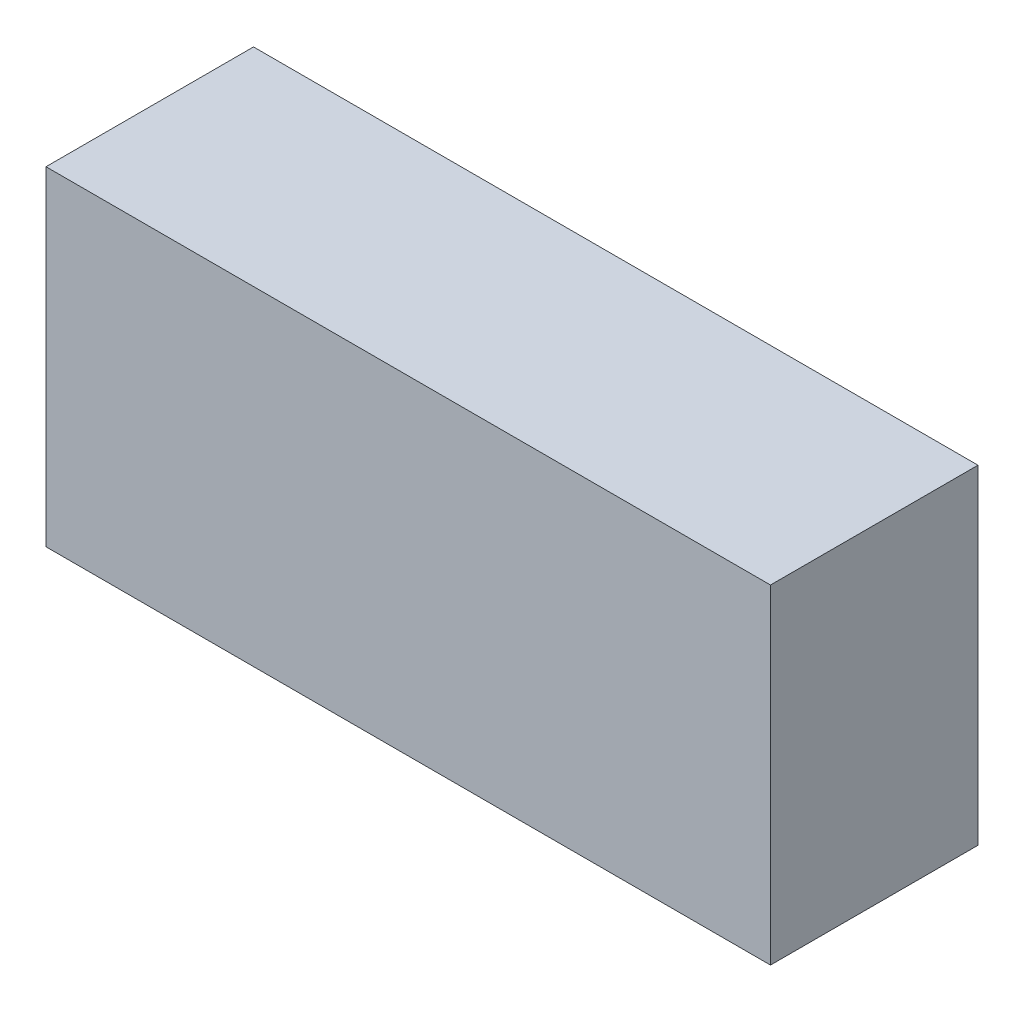
ISO-10303-21;
HEADER;
FILE_DESCRIPTION(('STEP AP214'),'2;1');
FILE_NAME('part.step','',(''),(''),'','','');
FILE_SCHEMA(('AUTOMOTIVE_DESIGN { 1 0 10303 214 1 1 1 1 }'));
ENDSEC;
DATA;
#1=APPLICATION_CONTEXT('core data for automotive mechanical design processes');
#2=APPLICATION_PROTOCOL_DEFINITION('international standard','automotive_design',2000,#1);
#3=PRODUCT_CONTEXT('',#1,'mechanical');
#4=PRODUCT('Part','Part','',(#3));
#5=PRODUCT_RELATED_PRODUCT_CATEGORY('part','',(#4));
#6=PRODUCT_DEFINITION_FORMATION('','',#4);
#7=PRODUCT_DEFINITION_CONTEXT('part definition',#1,'design');
#8=PRODUCT_DEFINITION('design','',#6,#7);
#9=PRODUCT_DEFINITION_SHAPE('','',#8);
#10=(LENGTH_UNIT() NAMED_UNIT(*) SI_UNIT(.MILLI.,.METRE.));
#11=(NAMED_UNIT(*) PLANE_ANGLE_UNIT() SI_UNIT($,.RADIAN.));
#12=(NAMED_UNIT(*) SI_UNIT($,.STERADIAN.) SOLID_ANGLE_UNIT());
#13=UNCERTAINTY_MEASURE_WITH_UNIT(LENGTH_MEASURE(1.E-05),#10,'distance_accuracy_value','');
#14=(GEOMETRIC_REPRESENTATION_CONTEXT(3) GLOBAL_UNCERTAINTY_ASSIGNED_CONTEXT((#13)) GLOBAL_UNIT_ASSIGNED_CONTEXT((#10,
#11,#12)) REPRESENTATION_CONTEXT('',''));
#15=CARTESIAN_POINT('',(0.,0.,0.));
#16=DIRECTION('',(0.,0.,1.));
#17=DIRECTION('',(1.,0.,0.));
#18=AXIS2_PLACEMENT_3D('',#15,#16,#17);
#19=CARTESIAN_POINT('',(1.396492,0.634492,0.8));
#20=DIRECTION('',(0.,0.,1.));
#21=DIRECTION('',(1.,0.,0.));
#22=AXIS2_PLACEMENT_3D('',#19,#20,#21);
#23=PLANE('',#22);
#24=DIRECTION('',(0.,1.,0.));
#25=VECTOR('',#24,1.);
#26=CARTESIAN_POINT('',(-1.396492,-0.634492,0.8));
#27=LINE('',#26,#25);
#28=CARTESIAN_POINT('',(-1.396492,-0.634492,0.8));
#29=VERTEX_POINT('',#28);
#30=CARTESIAN_POINT('',(-1.396492,0.634492,0.8));
#31=VERTEX_POINT('',#30);
#32=EDGE_CURVE('E58',#29,#31,#27,.T.);
#33=ORIENTED_EDGE('',*,*,#32,.F.);
#34=DIRECTION('',(1.,0.,0.));
#35=VECTOR('',#34,1.);
#36=CARTESIAN_POINT('',(1.396492,-0.634492,0.8));
#37=LINE('',#36,#35);
#38=CARTESIAN_POINT('',(1.396492,-0.634492,0.8));
#39=VERTEX_POINT('',#38);
#40=EDGE_CURVE('E53',#39,#29,#37,.F.);
#41=ORIENTED_EDGE('',*,*,#40,.F.);
#42=DIRECTION('',(0.,1.,0.));
#43=VECTOR('',#42,1.);
#44=CARTESIAN_POINT('',(1.396492,0.634492,0.8));
#45=LINE('',#44,#43);
#46=CARTESIAN_POINT('',(1.396492,0.634492,0.8));
#47=VERTEX_POINT('',#46);
#48=EDGE_CURVE('E20',#39,#47,#45,.T.);
#49=ORIENTED_EDGE('',*,*,#48,.T.);
#50=DIRECTION('',(1.,0.,0.));
#51=VECTOR('',#50,1.);
#52=CARTESIAN_POINT('',(-1.396492,0.634492,0.8));
#53=LINE('',#52,#51);
#54=EDGE_CURVE('E67',#31,#47,#53,.T.);
#55=ORIENTED_EDGE('',*,*,#54,.F.);
#56=EDGE_LOOP('',(#33,#41,#49,#55));
#57=FACE_BOUND('',#56,.T.);
#58=ADVANCED_FACE('F17',(#57),#23,.T.);
#59=CARTESIAN_POINT('',(-1.396492,0.634492,0.));
#60=DIRECTION('',(0.,1.,0.));
#61=DIRECTION('',(0.,0.,1.));
#62=AXIS2_PLACEMENT_3D('',#59,#60,#61);
#63=PLANE('',#62);
#64=DIRECTION('',(0.,0.,-1.));
#65=VECTOR('',#64,1.);
#66=CARTESIAN_POINT('',(1.396492,0.634492,0.));
#67=LINE('',#66,#65);
#68=CARTESIAN_POINT('',(1.396492,0.634492,0.));
#69=VERTEX_POINT('',#68);
#70=EDGE_CURVE('E80',#69,#47,#67,.F.);
#71=ORIENTED_EDGE('',*,*,#70,.F.);
#72=DIRECTION('',(1.,0.,0.));
#73=VECTOR('',#72,1.);
#74=CARTESIAN_POINT('',(1.396492,0.634492,0.));
#75=LINE('',#74,#73);
#76=CARTESIAN_POINT('',(-1.396492,0.634492,0.));
#77=VERTEX_POINT('',#76);
#78=EDGE_CURVE('E75',#69,#77,#75,.F.);
#79=ORIENTED_EDGE('',*,*,#78,.T.);
#80=DIRECTION('',(0.,0.,1.));
#81=VECTOR('',#80,1.);
#82=CARTESIAN_POINT('',(-1.396492,0.634492,0.));
#83=LINE('',#82,#81);
#84=EDGE_CURVE('E63',#31,#77,#83,.F.);
#85=ORIENTED_EDGE('',*,*,#84,.F.);
#86=ORIENTED_EDGE('',*,*,#54,.T.);
#87=EDGE_LOOP('',(#71,#79,#85,#86));
#88=FACE_BOUND('',#87,.T.);
#89=ADVANCED_FACE('F74',(#88),#63,.T.);
#90=CARTESIAN_POINT('',(-1.396492,-0.634492,0.));
#91=DIRECTION('',(-1.,0.,0.));
#92=DIRECTION('',(0.,0.,1.));
#93=AXIS2_PLACEMENT_3D('',#90,#91,#92);
#94=PLANE('',#93);
#95=ORIENTED_EDGE('',*,*,#84,.T.);
#96=DIRECTION('',(0.,1.,0.));
#97=VECTOR('',#96,1.);
#98=CARTESIAN_POINT('',(-1.396492,0.634492,0.));
#99=LINE('',#98,#97);
#100=CARTESIAN_POINT('',(-1.396492,-0.634492,0.));
#101=VERTEX_POINT('',#100);
#102=EDGE_CURVE('E84',#77,#101,#99,.F.);
#103=ORIENTED_EDGE('',*,*,#102,.T.);
#104=DIRECTION('',(0.,0.,-1.));
#105=VECTOR('',#104,1.);
#106=CARTESIAN_POINT('',(-1.396492,-0.634492,0.));
#107=LINE('',#106,#105);
#108=EDGE_CURVE('E65',#29,#101,#107,.T.);
#109=ORIENTED_EDGE('',*,*,#108,.F.);
#110=ORIENTED_EDGE('',*,*,#32,.T.);
#111=EDGE_LOOP('',(#95,#103,#109,#110));
#112=FACE_BOUND('',#111,.T.);
#113=ADVANCED_FACE('F60',(#112),#94,.T.);
#114=CARTESIAN_POINT('',(1.396492,-0.634492,0.));
#115=DIRECTION('',(0.,-1.,0.));
#116=DIRECTION('',(0.,0.,-1.));
#117=AXIS2_PLACEMENT_3D('',#114,#115,#116);
#118=PLANE('',#117);
#119=ORIENTED_EDGE('',*,*,#108,.T.);
#120=DIRECTION('',(1.,0.,0.));
#121=VECTOR('',#120,1.);
#122=CARTESIAN_POINT('',(1.396492,-0.634492,0.));
#123=LINE('',#122,#121);
#124=CARTESIAN_POINT('',(1.396492,-0.634492,0.));
#125=VERTEX_POINT('',#124);
#126=EDGE_CURVE('E26',#101,#125,#123,.T.);
#127=ORIENTED_EDGE('',*,*,#126,.T.);
#128=DIRECTION('',(0.,0.,-1.));
#129=VECTOR('',#128,1.);
#130=CARTESIAN_POINT('',(1.396492,-0.634492,0.));
#131=LINE('',#130,#129);
#132=EDGE_CURVE('E34',#39,#125,#131,.T.);
#133=ORIENTED_EDGE('',*,*,#132,.F.);
#134=ORIENTED_EDGE('',*,*,#40,.T.);
#135=EDGE_LOOP('',(#119,#127,#133,#134));
#136=FACE_BOUND('',#135,.T.);
#137=ADVANCED_FACE('F88',(#136),#118,.T.);
#138=CARTESIAN_POINT('',(1.396492,0.634492,0.));
#139=DIRECTION('',(1.,0.,0.));
#140=DIRECTION('',(0.,0.,-1.));
#141=AXIS2_PLACEMENT_3D('',#138,#139,#140);
#142=PLANE('',#141);
#143=ORIENTED_EDGE('',*,*,#132,.T.);
#144=DIRECTION('',(0.,1.,0.));
#145=VECTOR('',#144,1.);
#146=CARTESIAN_POINT('',(1.396492,0.634492,0.));
#147=LINE('',#146,#145);
#148=EDGE_CURVE('E11',#125,#69,#147,.T.);
#149=ORIENTED_EDGE('',*,*,#148,.T.);
#150=ORIENTED_EDGE('',*,*,#70,.T.);
#151=ORIENTED_EDGE('',*,*,#48,.F.);
#152=EDGE_LOOP('',(#143,#149,#150,#151));
#153=FACE_BOUND('',#152,.T.);
#154=ADVANCED_FACE('F91',(#153),#142,.T.);
#155=CARTESIAN_POINT('',(1.396492,0.634492,0.));
#156=DIRECTION('',(0.,0.,1.));
#157=DIRECTION('',(1.,0.,0.));
#158=AXIS2_PLACEMENT_3D('',#155,#156,#157);
#159=PLANE('',#158);
#160=ORIENTED_EDGE('',*,*,#126,.F.);
#161=ORIENTED_EDGE('',*,*,#102,.F.);
#162=ORIENTED_EDGE('',*,*,#78,.F.);
#163=ORIENTED_EDGE('',*,*,#148,.F.);
#164=EDGE_LOOP('',(#160,#161,#162,#163));
#165=FACE_BOUND('',#164,.T.);
#166=ADVANCED_FACE('F90',(#165),#159,.F.);
#167=CLOSED_SHELL('',(#58,#89,#113,#137,#154,#166));
#168=MANIFOLD_SOLID_BREP('B1',#167);
#169=ADVANCED_BREP_SHAPE_REPRESENTATION('',(#18,#168),#14);
#170=SHAPE_DEFINITION_REPRESENTATION(#9,#169);
ENDSEC;
END-ISO-10303-21;
